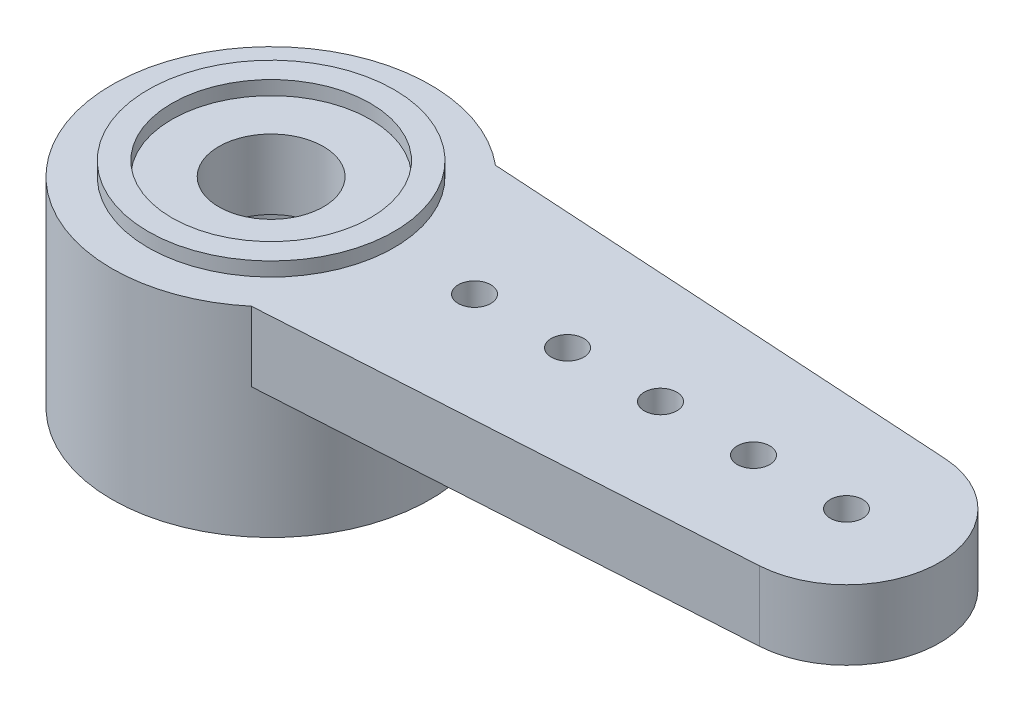
ISO-10303-21;
HEADER;
FILE_DESCRIPTION(('STEP AP214'),'2;1');
FILE_NAME('part.step','',(''),(''),'','','');
FILE_SCHEMA(('AUTOMOTIVE_DESIGN { 1 0 10303 214 1 1 1 1 }'));
ENDSEC;
DATA;
#1=APPLICATION_CONTEXT('core data for automotive mechanical design processes');
#2=APPLICATION_PROTOCOL_DEFINITION('international standard','automotive_design',2000,#1);
#3=PRODUCT_CONTEXT('',#1,'mechanical');
#4=PRODUCT('Part','Part','',(#3));
#5=PRODUCT_RELATED_PRODUCT_CATEGORY('part','',(#4));
#6=PRODUCT_DEFINITION_FORMATION('','',#4);
#7=PRODUCT_DEFINITION_CONTEXT('part definition',#1,'design');
#8=PRODUCT_DEFINITION('design','',#6,#7);
#9=PRODUCT_DEFINITION_SHAPE('','',#8);
#10=(LENGTH_UNIT() NAMED_UNIT(*) SI_UNIT(.MILLI.,.METRE.));
#11=(NAMED_UNIT(*) PLANE_ANGLE_UNIT() SI_UNIT($,.RADIAN.));
#12=(NAMED_UNIT(*) SI_UNIT($,.STERADIAN.) SOLID_ANGLE_UNIT());
#13=UNCERTAINTY_MEASURE_WITH_UNIT(LENGTH_MEASURE(1.E-05),#10,'distance_accuracy_value','');
#14=(GEOMETRIC_REPRESENTATION_CONTEXT(3) GLOBAL_UNCERTAINTY_ASSIGNED_CONTEXT((#13)) GLOBAL_UNIT_ASSIGNED_CONTEXT((#10,
#11,#12)) REPRESENTATION_CONTEXT('',''));
#15=CARTESIAN_POINT('',(0.,0.,0.));
#16=DIRECTION('',(0.,0.,1.));
#17=DIRECTION('',(1.,0.,0.));
#18=AXIS2_PLACEMENT_3D('',#15,#16,#17);
#19=CARTESIAN_POINT('',(0.,1.5,0.));
#20=DIRECTION('',(0.,-1.,0.));
#21=DIRECTION('',(0.,0.,-1.));
#22=AXIS2_PLACEMENT_3D('',#19,#20,#21);
#23=CYLINDRICAL_SURFACE('',#22,1.125);
#24=CARTESIAN_POINT('',(0.,1.5,0.));
#25=DIRECTION('',(0.,-1.,0.));
#26=DIRECTION('',(0.,0.,-1.));
#27=AXIS2_PLACEMENT_3D('',#24,#25,#26);
#28=CIRCLE('',#27,1.125);
#29=CARTESIAN_POINT('',(0.,1.5,-1.125));
#30=VERTEX_POINT('',#29);
#31=EDGE_CURVE('E137',#30,#30,#28,.T.);
#32=ORIENTED_EDGE('',*,*,#31,.F.);
#33=EDGE_LOOP('',(#32));
#34=FACE_BOUND('',#33,.T.);
#35=CARTESIAN_POINT('',(0.,0.,0.));
#36=DIRECTION('',(0.,-1.,0.));
#37=DIRECTION('',(0.,0.,-1.));
#38=AXIS2_PLACEMENT_3D('',#35,#36,#37);
#39=CIRCLE('',#38,1.125);
#40=CARTESIAN_POINT('',(0.,0.,-1.125));
#41=VERTEX_POINT('',#40);
#42=EDGE_CURVE('E19',#41,#41,#39,.T.);
#43=ORIENTED_EDGE('',*,*,#42,.T.);
#44=EDGE_LOOP('',(#43));
#45=FACE_BOUND('',#44,.T.);
#46=ADVANCED_FACE('F16',(#34,#45),#23,.F.);
#47=CARTESIAN_POINT('',(0.,0.,0.));
#48=DIRECTION('',(0.,1.,0.));
#49=DIRECTION('',(0.,0.,1.));
#50=AXIS2_PLACEMENT_3D('',#47,#48,#49);
#51=PLANE('',#50);
#52=ORIENTED_EDGE('',*,*,#42,.F.);
#53=EDGE_LOOP('',(#52));
#54=FACE_BOUND('',#53,.T.);
#55=CARTESIAN_POINT('',(0.,0.,0.));
#56=DIRECTION('',(0.,1.,0.));
#57=DIRECTION('',(0.,0.,1.));
#58=AXIS2_PLACEMENT_3D('',#55,#56,#57);
#59=CIRCLE('',#58,2.14);
#60=CARTESIAN_POINT('',(0.,0.,2.14));
#61=VERTEX_POINT('',#60);
#62=EDGE_CURVE('E135',#61,#61,#59,.F.);
#63=ORIENTED_EDGE('',*,*,#62,.T.);
#64=EDGE_LOOP('',(#63));
#65=FACE_BOUND('',#64,.T.);
#66=ADVANCED_FACE('F145',(#54,#65),#51,.F.);
#67=CARTESIAN_POINT('',(0.,1.5,0.));
#68=DIRECTION('',(0.,1.,0.));
#69=DIRECTION('',(0.,0.,1.));
#70=AXIS2_PLACEMENT_3D('',#67,#68,#69);
#71=PLANE('',#70);
#72=ORIENTED_EDGE('',*,*,#31,.T.);
#73=EDGE_LOOP('',(#72));
#74=FACE_BOUND('',#73,.T.);
#75=CARTESIAN_POINT('',(0.,1.5,0.));
#76=DIRECTION('',(0.,-1.,0.));
#77=DIRECTION('',(0.,0.,-1.));
#78=AXIS2_PLACEMENT_3D('',#75,#76,#77);
#79=CIRCLE('',#78,2.135);
#80=CARTESIAN_POINT('',(0.,1.5,-2.135));
#81=VERTEX_POINT('',#80);
#82=EDGE_CURVE('E132',#81,#81,#79,.F.);
#83=ORIENTED_EDGE('',*,*,#82,.T.);
#84=EDGE_LOOP('',(#83));
#85=FACE_BOUND('',#84,.T.);
#86=ADVANCED_FACE('F148',(#74,#85),#71,.T.);
#87=CARTESIAN_POINT('',(0.,-2.8,0.));
#88=DIRECTION('',(0.,1.,0.));
#89=DIRECTION('',(0.,0.,1.));
#90=AXIS2_PLACEMENT_3D('',#87,#88,#89);
#91=CYLINDRICAL_SURFACE('',#90,2.14);
#92=CARTESIAN_POINT('',(0.,-2.8,0.));
#93=DIRECTION('',(0.,1.,0.));
#94=DIRECTION('',(0.,0.,1.));
#95=AXIS2_PLACEMENT_3D('',#92,#93,#94);
#96=CIRCLE('',#95,2.14);
#97=CARTESIAN_POINT('',(0.,-2.8,2.14));
#98=VERTEX_POINT('',#97);
#99=EDGE_CURVE('E129',#98,#98,#96,.F.);
#100=ORIENTED_EDGE('',*,*,#99,.T.);
#101=EDGE_LOOP('',(#100));
#102=FACE_BOUND('',#101,.T.);
#103=ORIENTED_EDGE('',*,*,#62,.F.);
#104=EDGE_LOOP('',(#103));
#105=FACE_BOUND('',#104,.T.);
#106=ADVANCED_FACE('F151',(#102,#105),#91,.F.);
#107=CARTESIAN_POINT('',(0.,1.8,0.));
#108=DIRECTION('',(0.,-1.,0.));
#109=DIRECTION('',(0.,0.,-1.));
#110=AXIS2_PLACEMENT_3D('',#107,#108,#109);
#111=CYLINDRICAL_SURFACE('',#110,2.135);
#112=CARTESIAN_POINT('',(0.,1.8,0.));
#113=DIRECTION('',(0.,-1.,0.));
#114=DIRECTION('',(0.,0.,-1.));
#115=AXIS2_PLACEMENT_3D('',#112,#113,#114);
#116=CIRCLE('',#115,2.135);
#117=CARTESIAN_POINT('',(0.,1.8,-2.135));
#118=VERTEX_POINT('',#117);
#119=EDGE_CURVE('E126',#118,#118,#116,.T.);
#120=ORIENTED_EDGE('',*,*,#119,.F.);
#121=EDGE_LOOP('',(#120));
#122=FACE_BOUND('',#121,.T.);
#123=ORIENTED_EDGE('',*,*,#82,.F.);
#124=EDGE_LOOP('',(#123));
#125=FACE_BOUND('',#124,.T.);
#126=ADVANCED_FACE('F153',(#122,#125),#111,.F.);
#127=CARTESIAN_POINT('',(0.,-2.8,0.));
#128=DIRECTION('',(0.,1.,0.));
#129=DIRECTION('',(0.,0.,1.));
#130=AXIS2_PLACEMENT_3D('',#127,#128,#129);
#131=PLANE('',#130);
#132=CARTESIAN_POINT('',(0.,-2.8,0.));
#133=DIRECTION('',(0.,1.,0.));
#134=DIRECTION('',(0.,0.,1.));
#135=AXIS2_PLACEMENT_3D('',#132,#133,#134);
#136=CIRCLE('',#135,3.425);
#137=CARTESIAN_POINT('',(0.,-2.8,3.425));
#138=VERTEX_POINT('',#137);
#139=EDGE_CURVE('E67',#138,#138,#136,.T.);
#140=ORIENTED_EDGE('',*,*,#139,.F.);
#141=EDGE_LOOP('',(#140));
#142=FACE_BOUND('',#141,.T.);
#143=ORIENTED_EDGE('',*,*,#99,.F.);
#144=EDGE_LOOP('',(#143));
#145=FACE_BOUND('',#144,.T.);
#146=ADVANCED_FACE('F161',(#142,#145),#131,.F.);
#147=CARTESIAN_POINT('',(0.,0.,0.));
#148=DIRECTION('',(0.,1.,0.));
#149=DIRECTION('',(0.,0.,1.));
#150=AXIS2_PLACEMENT_3D('',#147,#148,#149);
#151=PLANE('',#150);
#152=CARTESIAN_POINT('',(0.,0.,0.));
#153=DIRECTION('',(0.,1.,0.));
#154=DIRECTION('',(0.,0.,1.));
#155=AXIS2_PLACEMENT_3D('',#152,#153,#154);
#156=CIRCLE('',#155,3.425);
#157=CARTESIAN_POINT('',(2.2,0.,-2.625));
#158=VERTEX_POINT('',#157);
#159=CARTESIAN_POINT('',(2.2,0.,2.625));
#160=VERTEX_POINT('',#159);
#161=EDGE_CURVE('E55',#158,#160,#156,.F.);
#162=ORIENTED_EDGE('',*,*,#161,.F.);
#163=DIRECTION('',(0.99814109576817,0.,0.0609454915372431));
#164=VECTOR('',#163,1.);
#165=CARTESIAN_POINT('',(2.2,0.,-2.625));
#166=LINE('',#165,#164);
#167=CARTESIAN_POINT('',(12.4968909830745,0.,-1.99628219153634));
#168=VERTEX_POINT('',#167);
#169=EDGE_CURVE('E60',#158,#168,#166,.T.);
#170=ORIENTED_EDGE('',*,*,#169,.T.);
#171=CARTESIAN_POINT('',(12.375,0.,0.));
#172=DIRECTION('',(0.,-1.,0.));
#173=DIRECTION('',(0.,0.,-1.));
#174=AXIS2_PLACEMENT_3D('',#171,#172,#173);
#175=CIRCLE('',#174,2.);
#176=CARTESIAN_POINT('',(12.4968909830745,0.,1.99628219153634));
#177=VERTEX_POINT('',#176);
#178=EDGE_CURVE('E86',#177,#168,#175,.F.);
#179=ORIENTED_EDGE('',*,*,#178,.F.);
#180=DIRECTION('',(-0.99814109576817,0.,0.0609454915372431));
#181=VECTOR('',#180,1.);
#182=CARTESIAN_POINT('',(12.4968909830745,0.,1.99628219153634));
#183=LINE('',#182,#181);
#184=EDGE_CURVE('E62',#177,#160,#183,.T.);
#185=ORIENTED_EDGE('',*,*,#184,.T.);
#186=EDGE_LOOP('',(#162,#170,#179,#185));
#187=FACE_BOUND('',#186,.T.);
#188=CARTESIAN_POINT('',(6.375,0.,0.));
#189=DIRECTION('',(0.,-1.,0.));
#190=DIRECTION('',(0.,0.,-1.));
#191=AXIS2_PLACEMENT_3D('',#188,#189,#190);
#192=CIRCLE('',#191,0.349999999999999);
#193=CARTESIAN_POINT('',(6.375,0.,-0.349999999999957));
#194=VERTEX_POINT('',#193);
#195=EDGE_CURVE('E123',#194,#194,#192,.F.);
#196=ORIENTED_EDGE('',*,*,#195,.T.);
#197=EDGE_LOOP('',(#196));
#198=FACE_BOUND('',#197,.T.);
#199=CARTESIAN_POINT('',(10.375,0.,0.));
#200=DIRECTION('',(0.,-1.,0.));
#201=DIRECTION('',(0.,0.,-1.));
#202=AXIS2_PLACEMENT_3D('',#199,#200,#201);
#203=CIRCLE('',#202,0.349999999999999);
#204=CARTESIAN_POINT('',(10.375,0.,-0.349999999999985));
#205=VERTEX_POINT('',#204);
#206=EDGE_CURVE('E120',#205,#205,#203,.F.);
#207=ORIENTED_EDGE('',*,*,#206,.T.);
#208=EDGE_LOOP('',(#207));
#209=FACE_BOUND('',#208,.T.);
#210=CARTESIAN_POINT('',(12.375,0.,0.));
#211=DIRECTION('',(0.,-1.,0.));
#212=DIRECTION('',(0.,0.,-1.));
#213=AXIS2_PLACEMENT_3D('',#210,#211,#212);
#214=CIRCLE('',#213,0.349999999999999);
#215=CARTESIAN_POINT('',(12.375,0.,-0.349999999999999));
#216=VERTEX_POINT('',#215);
#217=EDGE_CURVE('E117',#216,#216,#214,.F.);
#218=ORIENTED_EDGE('',*,*,#217,.T.);
#219=EDGE_LOOP('',(#218));
#220=FACE_BOUND('',#219,.T.);
#221=CARTESIAN_POINT('',(8.375,0.,0.));
#222=DIRECTION('',(0.,-1.,0.));
#223=DIRECTION('',(0.,0.,-1.));
#224=AXIS2_PLACEMENT_3D('',#221,#222,#223);
#225=CIRCLE('',#224,0.349999999999999);
#226=CARTESIAN_POINT('',(8.375,0.,-0.349999999999971));
#227=VERTEX_POINT('',#226);
#228=EDGE_CURVE('E78',#227,#227,#225,.F.);
#229=ORIENTED_EDGE('',*,*,#228,.T.);
#230=EDGE_LOOP('',(#229));
#231=FACE_BOUND('',#230,.T.);
#232=CARTESIAN_POINT('',(4.375,0.,0.));
#233=DIRECTION('',(0.,-1.,0.));
#234=DIRECTION('',(0.,0.,-1.));
#235=AXIS2_PLACEMENT_3D('',#232,#233,#234);
#236=CIRCLE('',#235,0.349999999999999);
#237=CARTESIAN_POINT('',(4.375,0.,-0.349999999999943));
#238=VERTEX_POINT('',#237);
#239=EDGE_CURVE('E81',#238,#238,#236,.F.);
#240=ORIENTED_EDGE('',*,*,#239,.T.);
#241=EDGE_LOOP('',(#240));
#242=FACE_BOUND('',#241,.T.);
#243=ADVANCED_FACE('F57',(#187,#198,#209,#220,#231,#242),#151,.F.);
#244=CARTESIAN_POINT('',(0.,1.8,0.));
#245=DIRECTION('',(0.,1.,0.));
#246=DIRECTION('',(0.,0.,1.));
#247=AXIS2_PLACEMENT_3D('',#244,#245,#246);
#248=PLANE('',#247);
#249=ORIENTED_EDGE('',*,*,#119,.T.);
#250=EDGE_LOOP('',(#249));
#251=FACE_BOUND('',#250,.T.);
#252=CARTESIAN_POINT('',(0.,1.8,0.));
#253=DIRECTION('',(0.,-1.,0.));
#254=DIRECTION('',(0.,0.,-1.));
#255=AXIS2_PLACEMENT_3D('',#252,#253,#254);
#256=CIRCLE('',#255,2.645);
#257=CARTESIAN_POINT('',(0.,1.8,-2.645));
#258=VERTEX_POINT('',#257);
#259=EDGE_CURVE('E108',#258,#258,#256,.T.);
#260=ORIENTED_EDGE('',*,*,#259,.F.);
#261=EDGE_LOOP('',(#260));
#262=FACE_BOUND('',#261,.T.);
#263=ADVANCED_FACE('F207',(#251,#262),#248,.T.);
#264=CARTESIAN_POINT('',(6.375,1.5,0.));
#265=DIRECTION('',(0.,-1.,0.));
#266=DIRECTION('',(0.,0.,-1.));
#267=AXIS2_PLACEMENT_3D('',#264,#265,#266);
#268=CYLINDRICAL_SURFACE('',#267,0.349999999999999);
#269=CARTESIAN_POINT('',(6.375,1.5,0.));
#270=DIRECTION('',(0.,-1.,0.));
#271=DIRECTION('',(0.,0.,-1.));
#272=AXIS2_PLACEMENT_3D('',#269,#270,#271);
#273=CIRCLE('',#272,0.349999999999999);
#274=CARTESIAN_POINT('',(6.375,1.5,-0.349999999999957));
#275=VERTEX_POINT('',#274);
#276=EDGE_CURVE('E105',#275,#275,#273,.T.);
#277=ORIENTED_EDGE('',*,*,#276,.F.);
#278=EDGE_LOOP('',(#277));
#279=FACE_BOUND('',#278,.T.);
#280=ORIENTED_EDGE('',*,*,#195,.F.);
#281=EDGE_LOOP('',(#280));
#282=FACE_BOUND('',#281,.T.);
#283=ADVANCED_FACE('F203',(#279,#282),#268,.F.);
#284=CARTESIAN_POINT('',(10.375,1.5,0.));
#285=DIRECTION('',(0.,-1.,0.));
#286=DIRECTION('',(0.,0.,-1.));
#287=AXIS2_PLACEMENT_3D('',#284,#285,#286);
#288=CYLINDRICAL_SURFACE('',#287,0.349999999999999);
#289=CARTESIAN_POINT('',(10.375,1.5,0.));
#290=DIRECTION('',(0.,-1.,0.));
#291=DIRECTION('',(0.,0.,-1.));
#292=AXIS2_PLACEMENT_3D('',#289,#290,#291);
#293=CIRCLE('',#292,0.349999999999999);
#294=CARTESIAN_POINT('',(10.375,1.5,-0.349999999999985));
#295=VERTEX_POINT('',#294);
#296=EDGE_CURVE('E102',#295,#295,#293,.T.);
#297=ORIENTED_EDGE('',*,*,#296,.F.);
#298=EDGE_LOOP('',(#297));
#299=FACE_BOUND('',#298,.T.);
#300=ORIENTED_EDGE('',*,*,#206,.F.);
#301=EDGE_LOOP('',(#300));
#302=FACE_BOUND('',#301,.T.);
#303=ADVANCED_FACE('F199',(#299,#302),#288,.F.);
#304=CARTESIAN_POINT('',(12.375,1.5,0.));
#305=DIRECTION('',(0.,-1.,0.));
#306=DIRECTION('',(0.,0.,-1.));
#307=AXIS2_PLACEMENT_3D('',#304,#305,#306);
#308=CYLINDRICAL_SURFACE('',#307,0.349999999999999);
#309=CARTESIAN_POINT('',(12.375,1.5,0.));
#310=DIRECTION('',(0.,-1.,0.));
#311=DIRECTION('',(0.,0.,-1.));
#312=AXIS2_PLACEMENT_3D('',#309,#310,#311);
#313=CIRCLE('',#312,0.349999999999999);
#314=CARTESIAN_POINT('',(12.375,1.5,-0.349999999999999));
#315=VERTEX_POINT('',#314);
#316=EDGE_CURVE('E99',#315,#315,#313,.T.);
#317=ORIENTED_EDGE('',*,*,#316,.F.);
#318=EDGE_LOOP('',(#317));
#319=FACE_BOUND('',#318,.T.);
#320=ORIENTED_EDGE('',*,*,#217,.F.);
#321=EDGE_LOOP('',(#320));
#322=FACE_BOUND('',#321,.T.);
#323=ADVANCED_FACE('F196',(#319,#322),#308,.F.);
#324=CARTESIAN_POINT('',(0.,-2.8,0.));
#325=DIRECTION('',(0.,1.,0.));
#326=DIRECTION('',(0.,0.,1.));
#327=AXIS2_PLACEMENT_3D('',#324,#325,#326);
#328=CYLINDRICAL_SURFACE('',#327,3.425);
#329=DIRECTION('',(0.,1.,0.));
#330=VECTOR('',#329,1.);
#331=CARTESIAN_POINT('',(2.2,1.5,2.625));
#332=LINE('',#331,#330);
#333=CARTESIAN_POINT('',(2.2,1.5,2.625));
#334=VERTEX_POINT('',#333);
#335=EDGE_CURVE('E66',#160,#334,#332,.T.);
#336=ORIENTED_EDGE('',*,*,#335,.T.);
#337=CARTESIAN_POINT('',(0.,1.5,0.));
#338=DIRECTION('',(0.,1.,0.));
#339=DIRECTION('',(0.,0.,1.));
#340=AXIS2_PLACEMENT_3D('',#337,#338,#339);
#341=CIRCLE('',#340,3.425);
#342=CARTESIAN_POINT('',(2.2,1.5,-2.625));
#343=VERTEX_POINT('',#342);
#344=EDGE_CURVE('E73',#343,#334,#341,.T.);
#345=ORIENTED_EDGE('',*,*,#344,.F.);
#346=DIRECTION('',(0.,1.,0.));
#347=VECTOR('',#346,1.);
#348=CARTESIAN_POINT('',(2.2,1.5,-2.625));
#349=LINE('',#348,#347);
#350=EDGE_CURVE('E70',#343,#158,#349,.F.);
#351=ORIENTED_EDGE('',*,*,#350,.T.);
#352=ORIENTED_EDGE('',*,*,#161,.T.);
#353=EDGE_LOOP('',(#336,#345,#351,#352));
#354=FACE_BOUND('',#353,.T.);
#355=ORIENTED_EDGE('',*,*,#139,.T.);
#356=EDGE_LOOP('',(#355));
#357=FACE_BOUND('',#356,.T.);
#358=ADVANCED_FACE('F71',(#354,#357),#328,.T.);
#359=CARTESIAN_POINT('',(12.4968909830745,1.5,1.99628219153634));
#360=DIRECTION('',(-0.0609454915372431,0.,-0.99814109576817));
#361=DIRECTION('',(-0.99814109576817,0.,0.0609454915372431));
#362=AXIS2_PLACEMENT_3D('',#359,#360,#361);
#363=PLANE('',#362);
#364=DIRECTION('',(0.,-1.,0.));
#365=VECTOR('',#364,1.);
#366=CARTESIAN_POINT('',(12.4968909830745,1.5,1.99628219153634));
#367=LINE('',#366,#365);
#368=CARTESIAN_POINT('',(12.4968909830745,1.5,1.99628219153634));
#369=VERTEX_POINT('',#368);
#370=EDGE_CURVE('E113',#369,#177,#367,.T.);
#371=ORIENTED_EDGE('',*,*,#370,.F.);
#372=DIRECTION('',(0.99814109576817,0.,-0.0609454915372431));
#373=VECTOR('',#372,1.);
#374=CARTESIAN_POINT('',(2.2,1.5,2.625));
#375=LINE('',#374,#373);
#376=EDGE_CURVE('E97',#334,#369,#375,.T.);
#377=ORIENTED_EDGE('',*,*,#376,.F.);
#378=ORIENTED_EDGE('',*,*,#335,.F.);
#379=ORIENTED_EDGE('',*,*,#184,.F.);
#380=EDGE_LOOP('',(#371,#377,#378,#379));
#381=FACE_BOUND('',#380,.T.);
#382=ADVANCED_FACE('F190',(#381),#363,.F.);
#383=CARTESIAN_POINT('',(12.375,1.5,0.));
#384=DIRECTION('',(0.,-1.,0.));
#385=DIRECTION('',(0.,0.,-1.));
#386=AXIS2_PLACEMENT_3D('',#383,#384,#385);
#387=CYLINDRICAL_SURFACE('',#386,2.);
#388=CARTESIAN_POINT('',(12.375,1.5,0.));
#389=DIRECTION('',(0.,-1.,0.));
#390=DIRECTION('',(0.,0.,-1.));
#391=AXIS2_PLACEMENT_3D('',#388,#389,#390);
#392=CIRCLE('',#391,2.);
#393=CARTESIAN_POINT('',(12.4968909830745,1.5,-1.99628219153634));
#394=VERTEX_POINT('',#393);
#395=EDGE_CURVE('E94',#369,#394,#392,.F.);
#396=ORIENTED_EDGE('',*,*,#395,.F.);
#397=ORIENTED_EDGE('',*,*,#370,.T.);
#398=ORIENTED_EDGE('',*,*,#178,.T.);
#399=DIRECTION('',(0.,1.,0.));
#400=VECTOR('',#399,1.);
#401=CARTESIAN_POINT('',(12.4968909830745,1.5,-1.99628219153634));
#402=LINE('',#401,#400);
#403=EDGE_CURVE('E34',#168,#394,#402,.T.);
#404=ORIENTED_EDGE('',*,*,#403,.T.);
#405=EDGE_LOOP('',(#396,#397,#398,#404));
#406=FACE_BOUND('',#405,.T.);
#407=ADVANCED_FACE('F187',(#406),#387,.T.);
#408=CARTESIAN_POINT('',(2.2,1.5,-2.625));
#409=DIRECTION('',(-0.0609454915372431,0.,0.99814109576817));
#410=DIRECTION('',(0.99814109576817,0.,0.0609454915372431));
#411=AXIS2_PLACEMENT_3D('',#408,#409,#410);
#412=PLANE('',#411);
#413=ORIENTED_EDGE('',*,*,#350,.F.);
#414=DIRECTION('',(-0.99814109576817,0.,-0.0609454915372431));
#415=VECTOR('',#414,1.);
#416=CARTESIAN_POINT('',(12.4968909830745,1.5,-1.99628219153634));
#417=LINE('',#416,#415);
#418=EDGE_CURVE('E93',#394,#343,#417,.T.);
#419=ORIENTED_EDGE('',*,*,#418,.F.);
#420=ORIENTED_EDGE('',*,*,#403,.F.);
#421=ORIENTED_EDGE('',*,*,#169,.F.);
#422=EDGE_LOOP('',(#413,#419,#420,#421));
#423=FACE_BOUND('',#422,.T.);
#424=ADVANCED_FACE('F77',(#423),#412,.F.);
#425=CARTESIAN_POINT('',(8.375,1.5,0.));
#426=DIRECTION('',(0.,-1.,0.));
#427=DIRECTION('',(0.,0.,-1.));
#428=AXIS2_PLACEMENT_3D('',#425,#426,#427);
#429=CYLINDRICAL_SURFACE('',#428,0.349999999999999);
#430=CARTESIAN_POINT('',(8.375,1.5,0.));
#431=DIRECTION('',(0.,-1.,0.));
#432=DIRECTION('',(0.,0.,-1.));
#433=AXIS2_PLACEMENT_3D('',#430,#431,#432);
#434=CIRCLE('',#433,0.349999999999999);
#435=CARTESIAN_POINT('',(8.375,1.5,-0.349999999999971));
#436=VERTEX_POINT('',#435);
#437=EDGE_CURVE('E90',#436,#436,#434,.T.);
#438=ORIENTED_EDGE('',*,*,#437,.F.);
#439=EDGE_LOOP('',(#438));
#440=FACE_BOUND('',#439,.T.);
#441=ORIENTED_EDGE('',*,*,#228,.F.);
#442=EDGE_LOOP('',(#441));
#443=FACE_BOUND('',#442,.T.);
#444=ADVANCED_FACE('F180',(#440,#443),#429,.F.);
#445=CARTESIAN_POINT('',(4.375,1.5,0.));
#446=DIRECTION('',(0.,-1.,0.));
#447=DIRECTION('',(0.,0.,-1.));
#448=AXIS2_PLACEMENT_3D('',#445,#446,#447);
#449=CYLINDRICAL_SURFACE('',#448,0.349999999999999);
#450=CARTESIAN_POINT('',(4.375,1.5,0.));
#451=DIRECTION('',(0.,-1.,0.));
#452=DIRECTION('',(0.,0.,-1.));
#453=AXIS2_PLACEMENT_3D('',#450,#451,#452);
#454=CIRCLE('',#453,0.349999999999999);
#455=CARTESIAN_POINT('',(4.375,1.5,-0.349999999999943));
#456=VERTEX_POINT('',#455);
#457=EDGE_CURVE('E25',#456,#456,#454,.T.);
#458=ORIENTED_EDGE('',*,*,#457,.F.);
#459=EDGE_LOOP('',(#458));
#460=FACE_BOUND('',#459,.T.);
#461=ORIENTED_EDGE('',*,*,#239,.F.);
#462=EDGE_LOOP('',(#461));
#463=FACE_BOUND('',#462,.T.);
#464=ADVANCED_FACE('F173',(#460,#463),#449,.F.);
#465=CARTESIAN_POINT('',(0.,1.8,0.));
#466=DIRECTION('',(0.,-1.,0.));
#467=DIRECTION('',(0.,0.,-1.));
#468=AXIS2_PLACEMENT_3D('',#465,#466,#467);
#469=CYLINDRICAL_SURFACE('',#468,2.645);
#470=CARTESIAN_POINT('',(0.,1.5,0.));
#471=DIRECTION('',(0.,-1.,0.));
#472=DIRECTION('',(0.,0.,-1.));
#473=AXIS2_PLACEMENT_3D('',#470,#471,#472);
#474=CIRCLE('',#473,2.645);
#475=CARTESIAN_POINT('',(0.,1.5,-2.645));
#476=VERTEX_POINT('',#475);
#477=EDGE_CURVE('E11',#476,#476,#474,.T.);
#478=ORIENTED_EDGE('',*,*,#477,.F.);
#479=EDGE_LOOP('',(#478));
#480=FACE_BOUND('',#479,.T.);
#481=ORIENTED_EDGE('',*,*,#259,.T.);
#482=EDGE_LOOP('',(#481));
#483=FACE_BOUND('',#482,.T.);
#484=ADVANCED_FACE('F167',(#480,#483),#469,.T.);
#485=CARTESIAN_POINT('',(0.,1.5,0.));
#486=DIRECTION('',(0.,1.,0.));
#487=DIRECTION('',(0.,0.,1.));
#488=AXIS2_PLACEMENT_3D('',#485,#486,#487);
#489=PLANE('',#488);
#490=ORIENTED_EDGE('',*,*,#477,.T.);
#491=EDGE_LOOP('',(#490));
#492=FACE_BOUND('',#491,.T.);
#493=ORIENTED_EDGE('',*,*,#457,.T.);
#494=EDGE_LOOP('',(#493));
#495=FACE_BOUND('',#494,.T.);
#496=ORIENTED_EDGE('',*,*,#437,.T.);
#497=EDGE_LOOP('',(#496));
#498=FACE_BOUND('',#497,.T.);
#499=ORIENTED_EDGE('',*,*,#395,.T.);
#500=ORIENTED_EDGE('',*,*,#418,.T.);
#501=ORIENTED_EDGE('',*,*,#344,.T.);
#502=ORIENTED_EDGE('',*,*,#376,.T.);
#503=EDGE_LOOP('',(#499,#500,#501,#502));
#504=FACE_BOUND('',#503,.T.);
#505=ORIENTED_EDGE('',*,*,#316,.T.);
#506=EDGE_LOOP('',(#505));
#507=FACE_BOUND('',#506,.T.);
#508=ORIENTED_EDGE('',*,*,#296,.T.);
#509=EDGE_LOOP('',(#508));
#510=FACE_BOUND('',#509,.T.);
#511=ORIENTED_EDGE('',*,*,#276,.T.);
#512=EDGE_LOOP('',(#511));
#513=FACE_BOUND('',#512,.T.);
#514=ADVANCED_FACE('F165',(#492,#495,#498,#504,#507,#510,#513),#489,.T.);
#515=CLOSED_SHELL('',(#46,#66,#86,#106,#126,#146,#243,#263,#283,#303,#323,#358,#382,#407,#424,
#444,#464,#484,#514));
#516=MANIFOLD_SOLID_BREP('B1',#515);
#517=ADVANCED_BREP_SHAPE_REPRESENTATION('',(#18,#516),#14);
#518=SHAPE_DEFINITION_REPRESENTATION(#9,#517);
ENDSEC;
END-ISO-10303-21;
